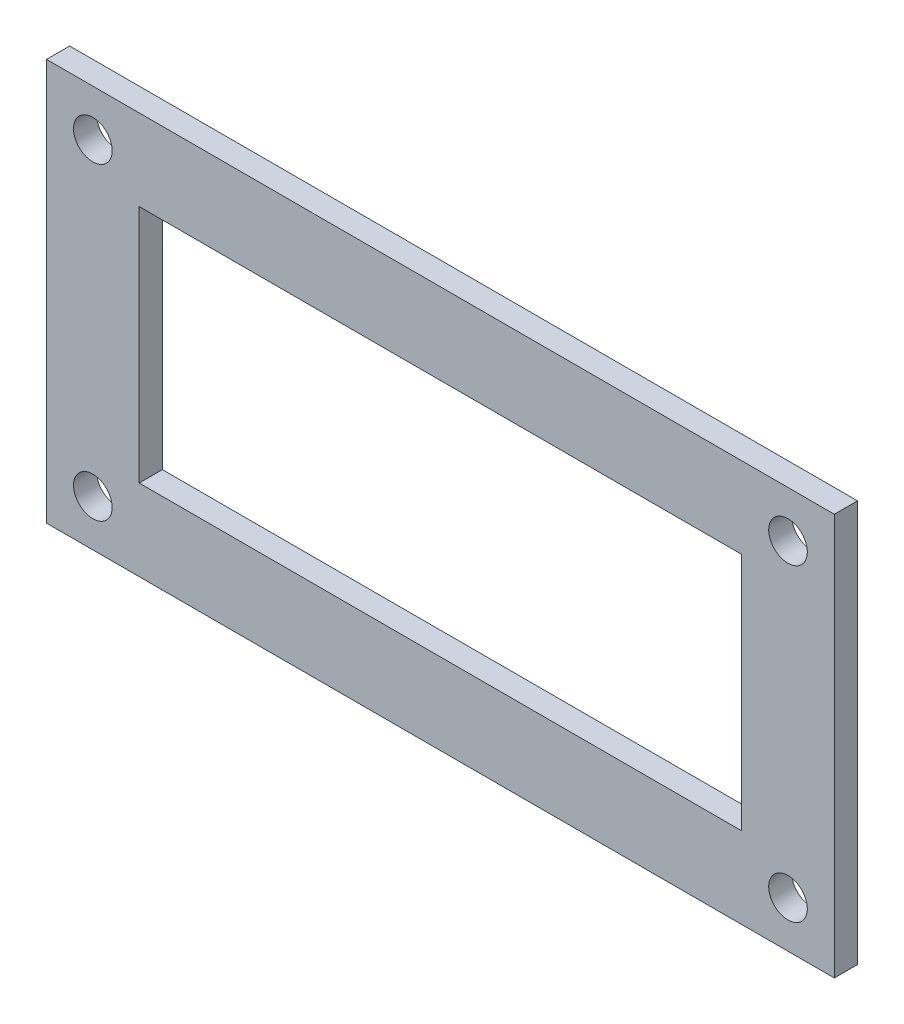
ISO-10303-21;
HEADER;
FILE_DESCRIPTION(('STEP AP214'),'2;1');
FILE_NAME('part.step','',(''),(''),'','','');
FILE_SCHEMA(('AUTOMOTIVE_DESIGN { 1 0 10303 214 1 1 1 1 }'));
ENDSEC;
DATA;
#1=APPLICATION_CONTEXT('core data for automotive mechanical design processes');
#2=APPLICATION_PROTOCOL_DEFINITION('international standard','automotive_design',2000,#1);
#3=PRODUCT_CONTEXT('',#1,'mechanical');
#4=PRODUCT('Part','Part','',(#3));
#5=PRODUCT_RELATED_PRODUCT_CATEGORY('part','',(#4));
#6=PRODUCT_DEFINITION_FORMATION('','',#4);
#7=PRODUCT_DEFINITION_CONTEXT('part definition',#1,'design');
#8=PRODUCT_DEFINITION('design','',#6,#7);
#9=PRODUCT_DEFINITION_SHAPE('','',#8);
#10=(LENGTH_UNIT() NAMED_UNIT(*) SI_UNIT(.MILLI.,.METRE.));
#11=(NAMED_UNIT(*) PLANE_ANGLE_UNIT() SI_UNIT($,.RADIAN.));
#12=(NAMED_UNIT(*) SI_UNIT($,.STERADIAN.) SOLID_ANGLE_UNIT());
#13=UNCERTAINTY_MEASURE_WITH_UNIT(LENGTH_MEASURE(1.E-05),#10,'distance_accuracy_value','');
#14=(GEOMETRIC_REPRESENTATION_CONTEXT(3) GLOBAL_UNCERTAINTY_ASSIGNED_CONTEXT((#13)) GLOBAL_UNIT_ASSIGNED_CONTEXT((#10,
#11,#12)) REPRESENTATION_CONTEXT('',''));
#15=CARTESIAN_POINT('',(0.,0.,0.));
#16=DIRECTION('',(0.,0.,1.));
#17=DIRECTION('',(1.,0.,0.));
#18=AXIS2_PLACEMENT_3D('',#15,#16,#17);
#19=CARTESIAN_POINT('',(0.,0.,3.));
#20=DIRECTION('',(0.,0.,-1.));
#21=DIRECTION('',(-1.,0.,0.));
#22=AXIS2_PLACEMENT_3D('',#19,#20,#21);
#23=PLANE('',#22);
#24=CARTESIAN_POINT('',(-45.,20.,3.));
#25=DIRECTION('',(0.,0.,-1.));
#26=DIRECTION('',(-1.,0.,0.));
#27=AXIS2_PLACEMENT_3D('',#24,#25,#26);
#28=CIRCLE('',#27,2.5);
#29=CARTESIAN_POINT('',(-47.5,20.,3.));
#30=VERTEX_POINT('',#29);
#31=EDGE_CURVE('E126',#30,#30,#28,.F.);
#32=ORIENTED_EDGE('',*,*,#31,.F.);
#33=EDGE_LOOP('',(#32));
#34=FACE_BOUND('',#33,.T.);
#35=CARTESIAN_POINT('',(45.,-20.,3.));
#36=DIRECTION('',(0.,0.,-1.));
#37=DIRECTION('',(-1.,0.,0.));
#38=AXIS2_PLACEMENT_3D('',#35,#36,#37);
#39=CIRCLE('',#38,2.5);
#40=CARTESIAN_POINT('',(42.5,-20.,3.));
#41=VERTEX_POINT('',#40);
#42=EDGE_CURVE('E241',#41,#41,#39,.F.);
#43=ORIENTED_EDGE('',*,*,#42,.F.);
#44=EDGE_LOOP('',(#43));
#45=FACE_BOUND('',#44,.T.);
#46=CARTESIAN_POINT('',(45.,20.,3.));
#47=DIRECTION('',(0.,0.,-1.));
#48=DIRECTION('',(-1.,0.,0.));
#49=AXIS2_PLACEMENT_3D('',#46,#47,#48);
#50=CIRCLE('',#49,2.5);
#51=CARTESIAN_POINT('',(42.5,20.,3.));
#52=VERTEX_POINT('',#51);
#53=EDGE_CURVE('E239',#52,#52,#50,.F.);
#54=ORIENTED_EDGE('',*,*,#53,.F.);
#55=EDGE_LOOP('',(#54));
#56=FACE_BOUND('',#55,.T.);
#57=CARTESIAN_POINT('',(-45.,-20.,3.));
#58=DIRECTION('',(0.,0.,-1.));
#59=DIRECTION('',(-1.,0.,0.));
#60=AXIS2_PLACEMENT_3D('',#57,#58,#59);
#61=CIRCLE('',#60,2.5);
#62=CARTESIAN_POINT('',(-47.5,-20.,3.));
#63=VERTEX_POINT('',#62);
#64=EDGE_CURVE('E242',#63,#63,#61,.F.);
#65=ORIENTED_EDGE('',*,*,#64,.F.);
#66=EDGE_LOOP('',(#65));
#67=FACE_BOUND('',#66,.T.);
#68=DIRECTION('',(0.,1.,0.));
#69=VECTOR('',#68,1.);
#70=CARTESIAN_POINT('',(51.,-26.,3.));
#71=LINE('',#70,#69);
#72=CARTESIAN_POINT('',(51.,-26.,3.));
#73=VERTEX_POINT('',#72);
#74=CARTESIAN_POINT('',(51.,26.,3.));
#75=VERTEX_POINT('',#74);
#76=EDGE_CURVE('E136',#73,#75,#71,.T.);
#77=ORIENTED_EDGE('',*,*,#76,.T.);
#78=DIRECTION('',(-1.,0.,0.));
#79=VECTOR('',#78,1.);
#80=CARTESIAN_POINT('',(-51.,26.,3.));
#81=LINE('',#80,#79);
#82=CARTESIAN_POINT('',(-51.,26.,3.));
#83=VERTEX_POINT('',#82);
#84=EDGE_CURVE('E139',#75,#83,#81,.T.);
#85=ORIENTED_EDGE('',*,*,#84,.T.);
#86=DIRECTION('',(0.,-1.,0.));
#87=VECTOR('',#86,1.);
#88=CARTESIAN_POINT('',(-51.,-26.,3.));
#89=LINE('',#88,#87);
#90=CARTESIAN_POINT('',(-51.,-26.,3.));
#91=VERTEX_POINT('',#90);
#92=EDGE_CURVE('E142',#83,#91,#89,.T.);
#93=ORIENTED_EDGE('',*,*,#92,.T.);
#94=DIRECTION('',(1.,0.,0.));
#95=VECTOR('',#94,1.);
#96=CARTESIAN_POINT('',(-51.,-26.,3.));
#97=LINE('',#96,#95);
#98=EDGE_CURVE('E144',#91,#73,#97,.T.);
#99=ORIENTED_EDGE('',*,*,#98,.T.);
#100=EDGE_LOOP('',(#77,#85,#93,#99));
#101=FACE_BOUND('',#100,.T.);
#102=DIRECTION('',(0.,1.,0.));
#103=VECTOR('',#102,1.);
#104=CARTESIAN_POINT('',(39.,-15.5,3.));
#105=LINE('',#104,#103);
#106=CARTESIAN_POINT('',(39.,-15.5,3.));
#107=VERTEX_POINT('',#106);
#108=CARTESIAN_POINT('',(39.,15.5,3.));
#109=VERTEX_POINT('',#108);
#110=EDGE_CURVE('E98',#107,#109,#105,.T.);
#111=ORIENTED_EDGE('',*,*,#110,.F.);
#112=DIRECTION('',(1.,0.,0.));
#113=VECTOR('',#112,1.);
#114=CARTESIAN_POINT('',(-39.,-15.5,3.));
#115=LINE('',#114,#113);
#116=CARTESIAN_POINT('',(-39.,-15.5,3.));
#117=VERTEX_POINT('',#116);
#118=EDGE_CURVE('E120',#117,#107,#115,.T.);
#119=ORIENTED_EDGE('',*,*,#118,.F.);
#120=DIRECTION('',(0.,-1.,0.));
#121=VECTOR('',#120,1.);
#122=CARTESIAN_POINT('',(-39.,-15.5,3.));
#123=LINE('',#122,#121);
#124=CARTESIAN_POINT('',(-39.,15.5,3.));
#125=VERTEX_POINT('',#124);
#126=EDGE_CURVE('E118',#125,#117,#123,.T.);
#127=ORIENTED_EDGE('',*,*,#126,.F.);
#128=DIRECTION('',(-1.,0.,0.));
#129=VECTOR('',#128,1.);
#130=CARTESIAN_POINT('',(-39.,15.5,3.));
#131=LINE('',#130,#129);
#132=EDGE_CURVE('E106',#109,#125,#131,.T.);
#133=ORIENTED_EDGE('',*,*,#132,.F.);
#134=EDGE_LOOP('',(#111,#119,#127,#133));
#135=FACE_BOUND('',#134,.T.);
#136=ADVANCED_FACE('F33',(#34,#45,#56,#67,#101,#135),#23,.F.);
#137=CARTESIAN_POINT('',(0.,0.,0.));
#138=DIRECTION('',(0.,0.,-1.));
#139=DIRECTION('',(-1.,0.,0.));
#140=AXIS2_PLACEMENT_3D('',#137,#138,#139);
#141=PLANE('',#140);
#142=CARTESIAN_POINT('',(-45.,20.,0.));
#143=DIRECTION('',(0.,0.,1.));
#144=DIRECTION('',(1.,0.,0.));
#145=AXIS2_PLACEMENT_3D('',#142,#143,#144);
#146=CIRCLE('',#145,2.5);
#147=CARTESIAN_POINT('',(-42.5,20.,0.));
#148=VERTEX_POINT('',#147);
#149=EDGE_CURVE('E254',#148,#148,#146,.T.);
#150=ORIENTED_EDGE('',*,*,#149,.T.);
#151=EDGE_LOOP('',(#150));
#152=FACE_BOUND('',#151,.T.);
#153=CARTESIAN_POINT('',(45.,-20.,0.));
#154=DIRECTION('',(0.,0.,1.));
#155=DIRECTION('',(1.,0.,0.));
#156=AXIS2_PLACEMENT_3D('',#153,#154,#155);
#157=CIRCLE('',#156,2.5);
#158=CARTESIAN_POINT('',(47.5,-20.,0.));
#159=VERTEX_POINT('',#158);
#160=EDGE_CURVE('E255',#159,#159,#157,.T.);
#161=ORIENTED_EDGE('',*,*,#160,.T.);
#162=EDGE_LOOP('',(#161));
#163=FACE_BOUND('',#162,.T.);
#164=CARTESIAN_POINT('',(45.,20.,0.));
#165=DIRECTION('',(0.,0.,1.));
#166=DIRECTION('',(-1.,0.,0.));
#167=AXIS2_PLACEMENT_3D('',#164,#165,#166);
#168=CIRCLE('',#167,2.5);
#169=CARTESIAN_POINT('',(42.5,20.,0.));
#170=VERTEX_POINT('',#169);
#171=EDGE_CURVE('E236',#170,#170,#168,.T.);
#172=ORIENTED_EDGE('',*,*,#171,.T.);
#173=EDGE_LOOP('',(#172));
#174=FACE_BOUND('',#173,.T.);
#175=CARTESIAN_POINT('',(-45.,-20.,0.));
#176=DIRECTION('',(0.,0.,1.));
#177=DIRECTION('',(-1.,0.,0.));
#178=AXIS2_PLACEMENT_3D('',#175,#176,#177);
#179=CIRCLE('',#178,2.5);
#180=CARTESIAN_POINT('',(-47.5,-20.,0.));
#181=VERTEX_POINT('',#180);
#182=EDGE_CURVE('E247',#181,#181,#179,.T.);
#183=ORIENTED_EDGE('',*,*,#182,.T.);
#184=EDGE_LOOP('',(#183));
#185=FACE_BOUND('',#184,.T.);
#186=DIRECTION('',(0.,1.,0.));
#187=VECTOR('',#186,1.);
#188=CARTESIAN_POINT('',(51.,-26.,0.));
#189=LINE('',#188,#187);
#190=CARTESIAN_POINT('',(51.,-26.,0.));
#191=VERTEX_POINT('',#190);
#192=CARTESIAN_POINT('',(51.,26.,0.));
#193=VERTEX_POINT('',#192);
#194=EDGE_CURVE('E114',#191,#193,#189,.T.);
#195=ORIENTED_EDGE('',*,*,#194,.F.);
#196=DIRECTION('',(1.,0.,0.));
#197=VECTOR('',#196,1.);
#198=CARTESIAN_POINT('',(-51.,-26.,0.));
#199=LINE('',#198,#197);
#200=CARTESIAN_POINT('',(-51.,-26.,0.));
#201=VERTEX_POINT('',#200);
#202=EDGE_CURVE('E140',#201,#191,#199,.T.);
#203=ORIENTED_EDGE('',*,*,#202,.F.);
#204=DIRECTION('',(0.,-1.,0.));
#205=VECTOR('',#204,1.);
#206=CARTESIAN_POINT('',(-51.,-26.,0.));
#207=LINE('',#206,#205);
#208=CARTESIAN_POINT('',(-51.,26.,0.));
#209=VERTEX_POINT('',#208);
#210=EDGE_CURVE('E151',#209,#201,#207,.T.);
#211=ORIENTED_EDGE('',*,*,#210,.F.);
#212=DIRECTION('',(-1.,0.,0.));
#213=VECTOR('',#212,1.);
#214=CARTESIAN_POINT('',(-51.,26.,0.));
#215=LINE('',#214,#213);
#216=EDGE_CURVE('E149',#193,#209,#215,.T.);
#217=ORIENTED_EDGE('',*,*,#216,.F.);
#218=EDGE_LOOP('',(#195,#203,#211,#217));
#219=FACE_BOUND('',#218,.T.);
#220=DIRECTION('',(1.,0.,0.));
#221=VECTOR('',#220,1.);
#222=CARTESIAN_POINT('',(-39.,-15.5,0.));
#223=LINE('',#222,#221);
#224=CARTESIAN_POINT('',(-39.,-15.5,0.));
#225=VERTEX_POINT('',#224);
#226=CARTESIAN_POINT('',(39.,-15.5,0.));
#227=VERTEX_POINT('',#226);
#228=EDGE_CURVE('E107',#225,#227,#223,.T.);
#229=ORIENTED_EDGE('',*,*,#228,.T.);
#230=DIRECTION('',(0.,1.,0.));
#231=VECTOR('',#230,1.);
#232=CARTESIAN_POINT('',(39.,-15.5,0.));
#233=LINE('',#232,#231);
#234=CARTESIAN_POINT('',(39.,15.5,0.));
#235=VERTEX_POINT('',#234);
#236=EDGE_CURVE('E56',#227,#235,#233,.T.);
#237=ORIENTED_EDGE('',*,*,#236,.T.);
#238=DIRECTION('',(-1.,0.,0.));
#239=VECTOR('',#238,1.);
#240=CARTESIAN_POINT('',(-39.,15.5,0.));
#241=LINE('',#240,#239);
#242=CARTESIAN_POINT('',(-39.,15.5,0.));
#243=VERTEX_POINT('',#242);
#244=EDGE_CURVE('E113',#235,#243,#241,.T.);
#245=ORIENTED_EDGE('',*,*,#244,.T.);
#246=DIRECTION('',(0.,-1.,0.));
#247=VECTOR('',#246,1.);
#248=CARTESIAN_POINT('',(-39.,-15.5,0.));
#249=LINE('',#248,#247);
#250=EDGE_CURVE('E128',#243,#225,#249,.T.);
#251=ORIENTED_EDGE('',*,*,#250,.T.);
#252=EDGE_LOOP('',(#229,#237,#245,#251));
#253=FACE_BOUND('',#252,.T.);
#254=ADVANCED_FACE('F169',(#152,#163,#174,#185,#219,#253),#141,.T.);
#255=CARTESIAN_POINT('',(51.,-26.,3.));
#256=DIRECTION('',(-1.,0.,0.));
#257=DIRECTION('',(0.,-1.,0.));
#258=AXIS2_PLACEMENT_3D('',#255,#256,#257);
#259=PLANE('',#258);
#260=ORIENTED_EDGE('',*,*,#194,.T.);
#261=DIRECTION('',(0.,0.,-1.));
#262=VECTOR('',#261,1.);
#263=CARTESIAN_POINT('',(51.,26.,3.));
#264=LINE('',#263,#262);
#265=EDGE_CURVE('E11',#75,#193,#264,.T.);
#266=ORIENTED_EDGE('',*,*,#265,.F.);
#267=ORIENTED_EDGE('',*,*,#76,.F.);
#268=DIRECTION('',(0.,0.,-1.));
#269=VECTOR('',#268,1.);
#270=CARTESIAN_POINT('',(51.,-26.,3.));
#271=LINE('',#270,#269);
#272=EDGE_CURVE('E146',#73,#191,#271,.T.);
#273=ORIENTED_EDGE('',*,*,#272,.T.);
#274=EDGE_LOOP('',(#260,#266,#267,#273));
#275=FACE_BOUND('',#274,.T.);
#276=ADVANCED_FACE('F35',(#275),#259,.F.);
#277=CARTESIAN_POINT('',(-51.,26.,3.));
#278=DIRECTION('',(0.,-1.,0.));
#279=DIRECTION('',(0.,0.,-1.));
#280=AXIS2_PLACEMENT_3D('',#277,#278,#279);
#281=PLANE('',#280);
#282=ORIENTED_EDGE('',*,*,#216,.T.);
#283=DIRECTION('',(0.,0.,-1.));
#284=VECTOR('',#283,1.);
#285=CARTESIAN_POINT('',(-51.,26.,3.));
#286=LINE('',#285,#284);
#287=EDGE_CURVE('E41',#83,#209,#286,.T.);
#288=ORIENTED_EDGE('',*,*,#287,.F.);
#289=ORIENTED_EDGE('',*,*,#84,.F.);
#290=ORIENTED_EDGE('',*,*,#265,.T.);
#291=EDGE_LOOP('',(#282,#288,#289,#290));
#292=FACE_BOUND('',#291,.T.);
#293=ADVANCED_FACE('F179',(#292),#281,.F.);
#294=CARTESIAN_POINT('',(-51.,-26.,3.));
#295=DIRECTION('',(1.,0.,0.));
#296=DIRECTION('',(0.,1.,0.));
#297=AXIS2_PLACEMENT_3D('',#294,#295,#296);
#298=PLANE('',#297);
#299=ORIENTED_EDGE('',*,*,#210,.T.);
#300=DIRECTION('',(0.,0.,-1.));
#301=VECTOR('',#300,1.);
#302=CARTESIAN_POINT('',(-51.,-26.,3.));
#303=LINE('',#302,#301);
#304=EDGE_CURVE('E156',#91,#201,#303,.T.);
#305=ORIENTED_EDGE('',*,*,#304,.F.);
#306=ORIENTED_EDGE('',*,*,#92,.F.);
#307=ORIENTED_EDGE('',*,*,#287,.T.);
#308=EDGE_LOOP('',(#299,#305,#306,#307));
#309=FACE_BOUND('',#308,.T.);
#310=ADVANCED_FACE('F163',(#309),#298,.F.);
#311=CARTESIAN_POINT('',(-51.,-26.,3.));
#312=DIRECTION('',(0.,1.,0.));
#313=DIRECTION('',(-1.,0.,0.));
#314=AXIS2_PLACEMENT_3D('',#311,#312,#313);
#315=PLANE('',#314);
#316=ORIENTED_EDGE('',*,*,#202,.T.);
#317=ORIENTED_EDGE('',*,*,#272,.F.);
#318=ORIENTED_EDGE('',*,*,#98,.F.);
#319=ORIENTED_EDGE('',*,*,#304,.T.);
#320=EDGE_LOOP('',(#316,#317,#318,#319));
#321=FACE_BOUND('',#320,.T.);
#322=ADVANCED_FACE('F173',(#321),#315,.F.);
#323=CARTESIAN_POINT('',(39.,-15.5,3.));
#324=DIRECTION('',(-1.,0.,0.));
#325=DIRECTION('',(0.,0.,1.));
#326=AXIS2_PLACEMENT_3D('',#323,#324,#325);
#327=PLANE('',#326);
#328=ORIENTED_EDGE('',*,*,#236,.F.);
#329=DIRECTION('',(0.,0.,-1.));
#330=VECTOR('',#329,1.);
#331=CARTESIAN_POINT('',(39.,-15.5,3.));
#332=LINE('',#331,#330);
#333=EDGE_CURVE('E102',#107,#227,#332,.T.);
#334=ORIENTED_EDGE('',*,*,#333,.F.);
#335=ORIENTED_EDGE('',*,*,#110,.T.);
#336=DIRECTION('',(0.,0.,-1.));
#337=VECTOR('',#336,1.);
#338=CARTESIAN_POINT('',(39.,15.5,3.));
#339=LINE('',#338,#337);
#340=EDGE_CURVE('E101',#109,#235,#339,.T.);
#341=ORIENTED_EDGE('',*,*,#340,.T.);
#342=EDGE_LOOP('',(#328,#334,#335,#341));
#343=FACE_BOUND('',#342,.T.);
#344=ADVANCED_FACE('F100',(#343),#327,.T.);
#345=CARTESIAN_POINT('',(-39.,15.5,3.));
#346=DIRECTION('',(0.,-1.,0.));
#347=DIRECTION('',(0.,0.,-1.));
#348=AXIS2_PLACEMENT_3D('',#345,#346,#347);
#349=PLANE('',#348);
#350=ORIENTED_EDGE('',*,*,#244,.F.);
#351=ORIENTED_EDGE('',*,*,#340,.F.);
#352=ORIENTED_EDGE('',*,*,#132,.T.);
#353=DIRECTION('',(0.,0.,-1.));
#354=VECTOR('',#353,1.);
#355=CARTESIAN_POINT('',(-39.,15.5,3.));
#356=LINE('',#355,#354);
#357=EDGE_CURVE('E115',#125,#243,#356,.T.);
#358=ORIENTED_EDGE('',*,*,#357,.T.);
#359=EDGE_LOOP('',(#350,#351,#352,#358));
#360=FACE_BOUND('',#359,.T.);
#361=ADVANCED_FACE('F110',(#360),#349,.T.);
#362=CARTESIAN_POINT('',(-39.,-15.5,3.));
#363=DIRECTION('',(1.,0.,0.));
#364=DIRECTION('',(0.,0.,-1.));
#365=AXIS2_PLACEMENT_3D('',#362,#363,#364);
#366=PLANE('',#365);
#367=ORIENTED_EDGE('',*,*,#250,.F.);
#368=ORIENTED_EDGE('',*,*,#357,.F.);
#369=ORIENTED_EDGE('',*,*,#126,.T.);
#370=DIRECTION('',(0.,0.,-1.));
#371=VECTOR('',#370,1.);
#372=CARTESIAN_POINT('',(-39.,-15.5,3.));
#373=LINE('',#372,#371);
#374=EDGE_CURVE('E48',#117,#225,#373,.T.);
#375=ORIENTED_EDGE('',*,*,#374,.T.);
#376=EDGE_LOOP('',(#367,#368,#369,#375));
#377=FACE_BOUND('',#376,.T.);
#378=ADVANCED_FACE('F206',(#377),#366,.T.);
#379=CARTESIAN_POINT('',(-39.,-15.5,3.));
#380=DIRECTION('',(0.,1.,0.));
#381=DIRECTION('',(-1.,0.,0.));
#382=AXIS2_PLACEMENT_3D('',#379,#380,#381);
#383=PLANE('',#382);
#384=ORIENTED_EDGE('',*,*,#228,.F.);
#385=ORIENTED_EDGE('',*,*,#374,.F.);
#386=ORIENTED_EDGE('',*,*,#118,.T.);
#387=ORIENTED_EDGE('',*,*,#333,.T.);
#388=EDGE_LOOP('',(#384,#385,#386,#387));
#389=FACE_BOUND('',#388,.T.);
#390=ADVANCED_FACE('F210',(#389),#383,.T.);
#391=CARTESIAN_POINT('',(-45.,-20.,31.));
#392=DIRECTION('',(0.,0.,-1.));
#393=DIRECTION('',(-1.,0.,0.));
#394=AXIS2_PLACEMENT_3D('',#391,#392,#393);
#395=CYLINDRICAL_SURFACE('',#394,2.5);
#396=ORIENTED_EDGE('',*,*,#182,.F.);
#397=EDGE_LOOP('',(#396));
#398=FACE_BOUND('',#397,.T.);
#399=ORIENTED_EDGE('',*,*,#64,.T.);
#400=EDGE_LOOP('',(#399));
#401=FACE_BOUND('',#400,.T.);
#402=ADVANCED_FACE('F216',(#398,#401),#395,.F.);
#403=CARTESIAN_POINT('',(45.,20.,31.));
#404=DIRECTION('',(0.,0.,-1.));
#405=DIRECTION('',(-1.,0.,0.));
#406=AXIS2_PLACEMENT_3D('',#403,#404,#405);
#407=CYLINDRICAL_SURFACE('',#406,2.5);
#408=ORIENTED_EDGE('',*,*,#171,.F.);
#409=EDGE_LOOP('',(#408));
#410=FACE_BOUND('',#409,.T.);
#411=ORIENTED_EDGE('',*,*,#53,.T.);
#412=EDGE_LOOP('',(#411));
#413=FACE_BOUND('',#412,.T.);
#414=ADVANCED_FACE('F219',(#410,#413),#407,.F.);
#415=CARTESIAN_POINT('',(45.,-20.,31.));
#416=DIRECTION('',(0.,0.,-1.));
#417=DIRECTION('',(-1.,0.,0.));
#418=AXIS2_PLACEMENT_3D('',#415,#416,#417);
#419=CYLINDRICAL_SURFACE('',#418,2.5);
#420=ORIENTED_EDGE('',*,*,#160,.F.);
#421=EDGE_LOOP('',(#420));
#422=FACE_BOUND('',#421,.T.);
#423=ORIENTED_EDGE('',*,*,#42,.T.);
#424=EDGE_LOOP('',(#423));
#425=FACE_BOUND('',#424,.T.);
#426=ADVANCED_FACE('F221',(#422,#425),#419,.F.);
#427=CARTESIAN_POINT('',(-45.,20.,31.));
#428=DIRECTION('',(0.,0.,-1.));
#429=DIRECTION('',(-1.,0.,0.));
#430=AXIS2_PLACEMENT_3D('',#427,#428,#429);
#431=CYLINDRICAL_SURFACE('',#430,2.5);
#432=ORIENTED_EDGE('',*,*,#149,.F.);
#433=EDGE_LOOP('',(#432));
#434=FACE_BOUND('',#433,.T.);
#435=ORIENTED_EDGE('',*,*,#31,.T.);
#436=EDGE_LOOP('',(#435));
#437=FACE_BOUND('',#436,.T.);
#438=ADVANCED_FACE('F224',(#434,#437),#431,.F.);
#439=CLOSED_SHELL('',(#136,#254,#276,#293,#310,#322,#344,#361,#378,#390,#402,#414,#426,#438));
#440=MANIFOLD_SOLID_BREP('B2',#439);
#441=ADVANCED_BREP_SHAPE_REPRESENTATION('',(#18,#440),#14);
#442=SHAPE_DEFINITION_REPRESENTATION(#9,#441);
ENDSEC;
END-ISO-10303-21;
